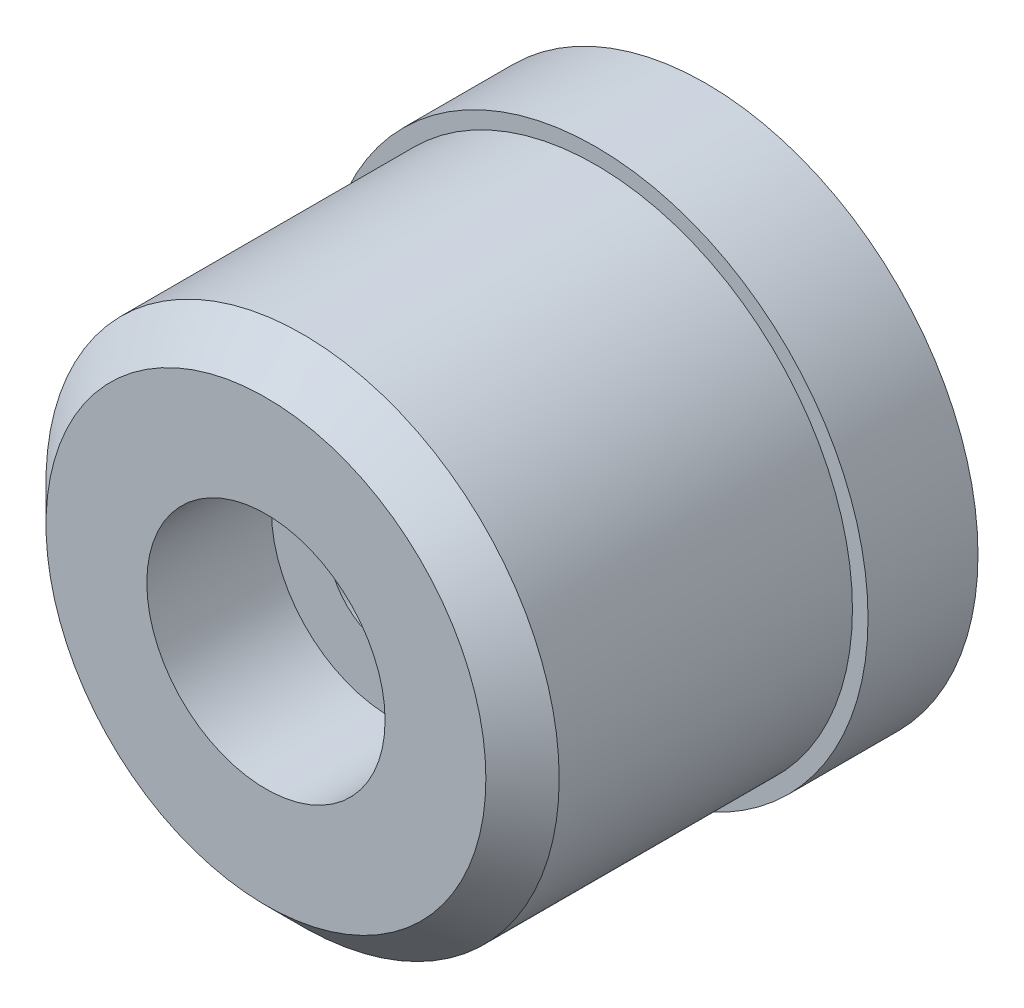
ISO-10303-21;
HEADER;
FILE_DESCRIPTION(('STEP AP214'),'2;1');
FILE_NAME('part.step','',(''),(''),'','','');
FILE_SCHEMA(('AUTOMOTIVE_DESIGN { 1 0 10303 214 1 1 1 1 }'));
ENDSEC;
DATA;
#1=APPLICATION_CONTEXT('core data for automotive mechanical design processes');
#2=APPLICATION_PROTOCOL_DEFINITION('international standard','automotive_design',2000,#1);
#3=PRODUCT_CONTEXT('',#1,'mechanical');
#4=PRODUCT('Part','Part','',(#3));
#5=PRODUCT_RELATED_PRODUCT_CATEGORY('part','',(#4));
#6=PRODUCT_DEFINITION_FORMATION('','',#4);
#7=PRODUCT_DEFINITION_CONTEXT('part definition',#1,'design');
#8=PRODUCT_DEFINITION('design','',#6,#7);
#9=PRODUCT_DEFINITION_SHAPE('','',#8);
#10=(LENGTH_UNIT() NAMED_UNIT(*) SI_UNIT(.MILLI.,.METRE.));
#11=(NAMED_UNIT(*) PLANE_ANGLE_UNIT() SI_UNIT($,.RADIAN.));
#12=(NAMED_UNIT(*) SI_UNIT($,.STERADIAN.) SOLID_ANGLE_UNIT());
#13=UNCERTAINTY_MEASURE_WITH_UNIT(LENGTH_MEASURE(1.E-05),#10,'distance_accuracy_value','');
#14=(GEOMETRIC_REPRESENTATION_CONTEXT(3) GLOBAL_UNCERTAINTY_ASSIGNED_CONTEXT((#13)) GLOBAL_UNIT_ASSIGNED_CONTEXT((#10,
#11,#12)) REPRESENTATION_CONTEXT('',''));
#15=CARTESIAN_POINT('',(0.,0.,0.));
#16=DIRECTION('',(0.,0.,1.));
#17=DIRECTION('',(1.,0.,0.));
#18=AXIS2_PLACEMENT_3D('',#15,#16,#17);
#19=CARTESIAN_POINT('',(0.,0.,3.));
#20=DIRECTION('',(0.,0.,-1.));
#21=DIRECTION('',(-1.,0.,0.));
#22=AXIS2_PLACEMENT_3D('',#19,#20,#21);
#23=CYLINDRICAL_SURFACE('',#22,7.425);
#24=CARTESIAN_POINT('',(0.,0.,3.));
#25=DIRECTION('',(0.,0.,1.));
#26=DIRECTION('',(1.,0.,0.));
#27=AXIS2_PLACEMENT_3D('',#24,#25,#26);
#28=CIRCLE('',#27,7.425);
#29=CARTESIAN_POINT('',(7.425,0.,3.));
#30=VERTEX_POINT('',#29);
#31=EDGE_CURVE('E46',#30,#30,#28,.T.);
#32=ORIENTED_EDGE('',*,*,#31,.F.);
#33=EDGE_LOOP('',(#32));
#34=FACE_BOUND('',#33,.T.);
#35=CARTESIAN_POINT('',(0.,0.,0.));
#36=DIRECTION('',(0.,0.,1.));
#37=DIRECTION('',(1.,0.,0.));
#38=AXIS2_PLACEMENT_3D('',#35,#36,#37);
#39=CIRCLE('',#38,7.425);
#40=CARTESIAN_POINT('',(7.425,0.,0.));
#41=VERTEX_POINT('',#40);
#42=EDGE_CURVE('E50',#41,#41,#39,.T.);
#43=ORIENTED_EDGE('',*,*,#42,.T.);
#44=EDGE_LOOP('',(#43));
#45=FACE_BOUND('',#44,.T.);
#46=ADVANCED_FACE('F34',(#34,#45),#23,.T.);
#47=CARTESIAN_POINT('',(0.,0.,3.));
#48=DIRECTION('',(0.,0.,1.));
#49=DIRECTION('',(1.,0.,0.));
#50=AXIS2_PLACEMENT_3D('',#47,#48,#49);
#51=PLANE('',#50);
#52=CARTESIAN_POINT('',(0.,0.,3.));
#53=DIRECTION('',(0.,0.,1.));
#54=DIRECTION('',(1.,0.,0.));
#55=AXIS2_PLACEMENT_3D('',#52,#53,#54);
#56=CIRCLE('',#55,7.);
#57=CARTESIAN_POINT('',(7.,0.,3.));
#58=VERTEX_POINT('',#57);
#59=EDGE_CURVE('E54',#58,#58,#56,.F.);
#60=ORIENTED_EDGE('',*,*,#59,.T.);
#61=EDGE_LOOP('',(#60));
#62=FACE_BOUND('',#61,.T.);
#63=ORIENTED_EDGE('',*,*,#31,.T.);
#64=EDGE_LOOP('',(#63));
#65=FACE_BOUND('',#64,.T.);
#66=ADVANCED_FACE('F88',(#62,#65),#51,.T.);
#67=CARTESIAN_POINT('',(0.,0.,0.));
#68=DIRECTION('',(0.,0.,1.));
#69=DIRECTION('',(1.,0.,0.));
#70=AXIS2_PLACEMENT_3D('',#67,#68,#69);
#71=PLANE('',#70);
#72=CARTESIAN_POINT('',(0.,0.,0.));
#73=DIRECTION('',(0.,0.,1.));
#74=DIRECTION('',(1.,0.,0.));
#75=AXIS2_PLACEMENT_3D('',#72,#73,#74);
#76=CIRCLE('',#75,1.7);
#77=CARTESIAN_POINT('',(1.7,0.,0.));
#78=VERTEX_POINT('',#77);
#79=EDGE_CURVE('E58',#78,#78,#76,.T.);
#80=ORIENTED_EDGE('',*,*,#79,.T.);
#81=EDGE_LOOP('',(#80));
#82=FACE_BOUND('',#81,.T.);
#83=ORIENTED_EDGE('',*,*,#42,.F.);
#84=EDGE_LOOP('',(#83));
#85=FACE_BOUND('',#84,.T.);
#86=ADVANCED_FACE('F85',(#82,#85),#71,.F.);
#87=CARTESIAN_POINT('',(0.,0.,12.));
#88=DIRECTION('',(0.,0.,-1.));
#89=DIRECTION('',(-1.,0.,0.));
#90=AXIS2_PLACEMENT_3D('',#87,#88,#89);
#91=CYLINDRICAL_SURFACE('',#90,7.);
#92=CARTESIAN_POINT('',(0.,0.,11.));
#93=DIRECTION('',(0.,0.,1.));
#94=DIRECTION('',(1.,0.,0.));
#95=AXIS2_PLACEMENT_3D('',#92,#93,#94);
#96=CIRCLE('',#95,7.);
#97=CARTESIAN_POINT('',(7.,0.,11.));
#98=VERTEX_POINT('',#97);
#99=EDGE_CURVE('E10',#98,#98,#96,.F.);
#100=ORIENTED_EDGE('',*,*,#99,.T.);
#101=EDGE_LOOP('',(#100));
#102=FACE_BOUND('',#101,.T.);
#103=ORIENTED_EDGE('',*,*,#59,.F.);
#104=EDGE_LOOP('',(#103));
#105=FACE_BOUND('',#104,.T.);
#106=ADVANCED_FACE('F76',(#102,#105),#91,.T.);
#107=CARTESIAN_POINT('',(0.,0.,12.));
#108=DIRECTION('',(0.,0.,1.));
#109=DIRECTION('',(1.,0.,0.));
#110=AXIS2_PLACEMENT_3D('',#107,#108,#109);
#111=PLANE('',#110);
#112=CARTESIAN_POINT('',(0.,0.,12.));
#113=DIRECTION('',(0.,0.,1.));
#114=DIRECTION('',(1.,0.,0.));
#115=AXIS2_PLACEMENT_3D('',#112,#113,#114);
#116=CIRCLE('',#115,6.);
#117=CARTESIAN_POINT('',(6.,0.,12.));
#118=VERTEX_POINT('',#117);
#119=EDGE_CURVE('E42',#118,#118,#116,.T.);
#120=ORIENTED_EDGE('',*,*,#119,.T.);
#121=EDGE_LOOP('',(#120));
#122=FACE_BOUND('',#121,.T.);
#123=CARTESIAN_POINT('',(0.,0.,12.));
#124=DIRECTION('',(0.,0.,1.));
#125=DIRECTION('',(1.,0.,0.));
#126=AXIS2_PLACEMENT_3D('',#123,#124,#125);
#127=CIRCLE('',#126,3.25);
#128=CARTESIAN_POINT('',(3.25,0.,12.));
#129=VERTEX_POINT('',#128);
#130=EDGE_CURVE('E67',#129,#129,#127,.T.);
#131=ORIENTED_EDGE('',*,*,#130,.F.);
#132=EDGE_LOOP('',(#131));
#133=FACE_BOUND('',#132,.T.);
#134=ADVANCED_FACE('F73',(#122,#133),#111,.T.);
#135=CARTESIAN_POINT('',(0.,0.,12.));
#136=DIRECTION('',(0.,0.,1.));
#137=DIRECTION('',(1.,0.,0.));
#138=AXIS2_PLACEMENT_3D('',#135,#136,#137);
#139=CYLINDRICAL_SURFACE('',#138,1.7);
#140=ORIENTED_EDGE('',*,*,#79,.F.);
#141=EDGE_LOOP('',(#140));
#142=FACE_BOUND('',#141,.T.);
#143=CARTESIAN_POINT('',(0.,0.,8.6));
#144=DIRECTION('',(0.,0.,1.));
#145=DIRECTION('',(1.,0.,0.));
#146=AXIS2_PLACEMENT_3D('',#143,#144,#145);
#147=CIRCLE('',#146,1.7);
#148=CARTESIAN_POINT('',(1.7,0.,8.6));
#149=VERTEX_POINT('',#148);
#150=EDGE_CURVE('E61',#149,#149,#147,.T.);
#151=ORIENTED_EDGE('',*,*,#150,.T.);
#152=EDGE_LOOP('',(#151));
#153=FACE_BOUND('',#152,.T.);
#154=ADVANCED_FACE('F75',(#142,#153),#139,.F.);
#155=CARTESIAN_POINT('',(1.7,0.,8.6));
#156=DIRECTION('',(0.,0.,-1.));
#157=DIRECTION('',(-1.,0.,0.));
#158=AXIS2_PLACEMENT_3D('',#155,#156,#157);
#159=PLANE('',#158);
#160=ORIENTED_EDGE('',*,*,#150,.F.);
#161=EDGE_LOOP('',(#160));
#162=FACE_BOUND('',#161,.T.);
#163=CARTESIAN_POINT('',(0.,0.,8.6));
#164=DIRECTION('',(0.,0.,1.));
#165=DIRECTION('',(1.,0.,0.));
#166=AXIS2_PLACEMENT_3D('',#163,#164,#165);
#167=CIRCLE('',#166,3.25);
#168=CARTESIAN_POINT('',(3.25,0.,8.6));
#169=VERTEX_POINT('',#168);
#170=EDGE_CURVE('E64',#169,#169,#167,.T.);
#171=ORIENTED_EDGE('',*,*,#170,.T.);
#172=EDGE_LOOP('',(#171));
#173=FACE_BOUND('',#172,.T.);
#174=ADVANCED_FACE('F82',(#162,#173),#159,.F.);
#175=CARTESIAN_POINT('',(0.,0.,12.));
#176=DIRECTION('',(0.,0.,1.));
#177=DIRECTION('',(1.,0.,0.));
#178=AXIS2_PLACEMENT_3D('',#175,#176,#177);
#179=CYLINDRICAL_SURFACE('',#178,3.25);
#180=ORIENTED_EDGE('',*,*,#170,.F.);
#181=EDGE_LOOP('',(#180));
#182=FACE_BOUND('',#181,.T.);
#183=ORIENTED_EDGE('',*,*,#130,.T.);
#184=EDGE_LOOP('',(#183));
#185=FACE_BOUND('',#184,.T.);
#186=ADVANCED_FACE('F71',(#182,#185),#179,.F.);
#187=CARTESIAN_POINT('',(0.,0.,12.));
#188=DIRECTION('',(0.,0.,-1.));
#189=DIRECTION('',(-1.,0.,0.));
#190=AXIS2_PLACEMENT_3D('',#187,#188,#189);
#191=CONICAL_SURFACE('',#190,6.,0.785398163397447);
#192=ORIENTED_EDGE('',*,*,#99,.F.);
#193=EDGE_LOOP('',(#192));
#194=FACE_BOUND('',#193,.T.);
#195=ORIENTED_EDGE('',*,*,#119,.F.);
#196=EDGE_LOOP('',(#195));
#197=FACE_BOUND('',#196,.T.);
#198=ADVANCED_FACE('F37',(#194,#197),#191,.T.);
#199=CLOSED_SHELL('',(#46,#66,#86,#106,#134,#154,#174,#186,#198));
#200=MANIFOLD_SOLID_BREP('B2',#199);
#201=ADVANCED_BREP_SHAPE_REPRESENTATION('',(#18,#200),#14);
#202=SHAPE_DEFINITION_REPRESENTATION(#9,#201);
ENDSEC;
END-ISO-10303-21;
